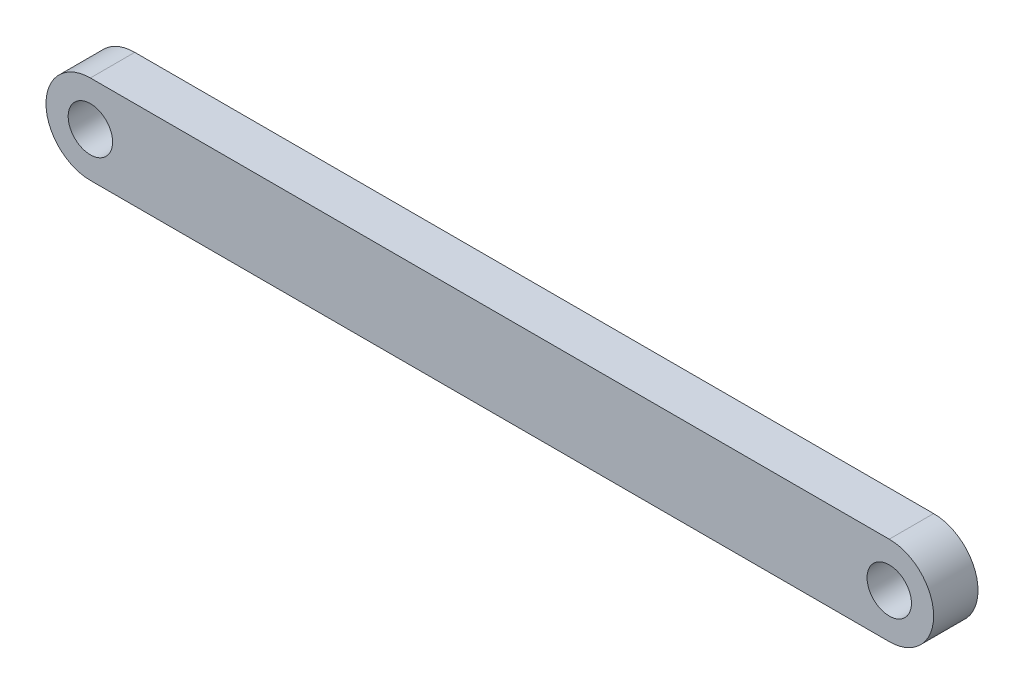
ISO-10303-21;
HEADER;
FILE_DESCRIPTION(('STEP AP214'),'2;1');
FILE_NAME('part.step','',(''),(''),'','','');
FILE_SCHEMA(('AUTOMOTIVE_DESIGN { 1 0 10303 214 1 1 1 1 }'));
ENDSEC;
DATA;
#1=APPLICATION_CONTEXT('core data for automotive mechanical design processes');
#2=APPLICATION_PROTOCOL_DEFINITION('international standard','automotive_design',2000,#1);
#3=PRODUCT_CONTEXT('',#1,'mechanical');
#4=PRODUCT('Part','Part','',(#3));
#5=PRODUCT_RELATED_PRODUCT_CATEGORY('part','',(#4));
#6=PRODUCT_DEFINITION_FORMATION('','',#4);
#7=PRODUCT_DEFINITION_CONTEXT('part definition',#1,'design');
#8=PRODUCT_DEFINITION('design','',#6,#7);
#9=PRODUCT_DEFINITION_SHAPE('','',#8);
#10=(LENGTH_UNIT() NAMED_UNIT(*) SI_UNIT(.MILLI.,.METRE.));
#11=(NAMED_UNIT(*) PLANE_ANGLE_UNIT() SI_UNIT($,.RADIAN.));
#12=(NAMED_UNIT(*) SI_UNIT($,.STERADIAN.) SOLID_ANGLE_UNIT());
#13=UNCERTAINTY_MEASURE_WITH_UNIT(LENGTH_MEASURE(1.E-05),#10,'distance_accuracy_value','');
#14=(GEOMETRIC_REPRESENTATION_CONTEXT(3) GLOBAL_UNCERTAINTY_ASSIGNED_CONTEXT((#13)) GLOBAL_UNIT_ASSIGNED_CONTEXT((#10,
#11,#12)) REPRESENTATION_CONTEXT('',''));
#15=CARTESIAN_POINT('',(0.,0.,0.));
#16=DIRECTION('',(0.,0.,1.));
#17=DIRECTION('',(1.,0.,0.));
#18=AXIS2_PLACEMENT_3D('',#15,#16,#17);
#19=CARTESIAN_POINT('',(-22.86,0.,-1.27));
#20=DIRECTION('',(0.,0.,1.));
#21=DIRECTION('',(1.,0.,0.));
#22=AXIS2_PLACEMENT_3D('',#19,#20,#21);
#23=CYLINDRICAL_SURFACE('',#22,2.54000000000001);
#24=DIRECTION('',(0.,0.,1.));
#25=VECTOR('',#24,1.);
#26=CARTESIAN_POINT('',(-22.86,-2.54000000000001,-1.27));
#27=LINE('',#26,#25);
#28=CARTESIAN_POINT('',(-22.86,-2.54000000000001,-1.27));
#29=VERTEX_POINT('',#28);
#30=CARTESIAN_POINT('',(-22.86,-2.54000000000001,1.27));
#31=VERTEX_POINT('',#30);
#32=EDGE_CURVE('E36',#29,#31,#27,.T.);
#33=ORIENTED_EDGE('',*,*,#32,.T.);
#34=CARTESIAN_POINT('',(-22.86,0.,1.27));
#35=DIRECTION('',(0.,0.,1.));
#36=DIRECTION('',(1.,0.,0.));
#37=AXIS2_PLACEMENT_3D('',#34,#35,#36);
#38=CIRCLE('',#37,2.54000000000001);
#39=CARTESIAN_POINT('',(-22.86,2.54000000000001,1.27));
#40=VERTEX_POINT('',#39);
#41=EDGE_CURVE('E73',#40,#31,#38,.T.);
#42=ORIENTED_EDGE('',*,*,#41,.F.);
#43=DIRECTION('',(0.,0.,1.));
#44=VECTOR('',#43,1.);
#45=CARTESIAN_POINT('',(-22.86,2.54000000000001,-1.27));
#46=LINE('',#45,#44);
#47=CARTESIAN_POINT('',(-22.86,2.54000000000001,-1.27));
#48=VERTEX_POINT('',#47);
#49=EDGE_CURVE('E11',#48,#40,#46,.T.);
#50=ORIENTED_EDGE('',*,*,#49,.F.);
#51=CARTESIAN_POINT('',(-22.86,0.,-1.27));
#52=DIRECTION('',(0.,0.,1.));
#53=DIRECTION('',(1.,0.,0.));
#54=AXIS2_PLACEMENT_3D('',#51,#52,#53);
#55=CIRCLE('',#54,2.54000000000001);
#56=EDGE_CURVE('E74',#48,#29,#55,.T.);
#57=ORIENTED_EDGE('',*,*,#56,.T.);
#58=EDGE_LOOP('',(#33,#42,#50,#57));
#59=FACE_BOUND('',#58,.T.);
#60=ADVANCED_FACE('F33',(#59),#23,.T.);
#61=CARTESIAN_POINT('',(-22.86,2.54000000000001,-1.27));
#62=DIRECTION('',(0.,1.,0.));
#63=DIRECTION('',(0.,0.,1.));
#64=AXIS2_PLACEMENT_3D('',#61,#62,#63);
#65=PLANE('',#64);
#66=ORIENTED_EDGE('',*,*,#49,.T.);
#67=DIRECTION('',(-1.,0.,0.));
#68=VECTOR('',#67,1.);
#69=CARTESIAN_POINT('',(-22.86,2.54000000000001,1.27));
#70=LINE('',#69,#68);
#71=CARTESIAN_POINT('',(22.86,2.54000000000001,1.27));
#72=VERTEX_POINT('',#71);
#73=EDGE_CURVE('E91',#72,#40,#70,.T.);
#74=ORIENTED_EDGE('',*,*,#73,.F.);
#75=DIRECTION('',(0.,0.,1.));
#76=VECTOR('',#75,1.);
#77=CARTESIAN_POINT('',(22.86,2.54000000000001,-1.27));
#78=LINE('',#77,#76);
#79=CARTESIAN_POINT('',(22.86,2.54000000000001,-1.27));
#80=VERTEX_POINT('',#79);
#81=EDGE_CURVE('E41',#80,#72,#78,.T.);
#82=ORIENTED_EDGE('',*,*,#81,.F.);
#83=DIRECTION('',(-1.,0.,0.));
#84=VECTOR('',#83,1.);
#85=CARTESIAN_POINT('',(-22.86,2.54000000000001,-1.27));
#86=LINE('',#85,#84);
#87=EDGE_CURVE('E79',#80,#48,#86,.T.);
#88=ORIENTED_EDGE('',*,*,#87,.T.);
#89=EDGE_LOOP('',(#66,#74,#82,#88));
#90=FACE_BOUND('',#89,.T.);
#91=ADVANCED_FACE('F117',(#90),#65,.T.);
#92=CARTESIAN_POINT('',(22.86,0.,-1.27));
#93=DIRECTION('',(0.,0.,1.));
#94=DIRECTION('',(1.,0.,0.));
#95=AXIS2_PLACEMENT_3D('',#92,#93,#94);
#96=CYLINDRICAL_SURFACE('',#95,2.54000000000001);
#97=ORIENTED_EDGE('',*,*,#81,.T.);
#98=CARTESIAN_POINT('',(22.86,0.,1.27));
#99=DIRECTION('',(0.,0.,1.));
#100=DIRECTION('',(1.,0.,0.));
#101=AXIS2_PLACEMENT_3D('',#98,#99,#100);
#102=CIRCLE('',#101,2.54000000000001);
#103=CARTESIAN_POINT('',(22.86,-2.54000000000001,1.27));
#104=VERTEX_POINT('',#103);
#105=EDGE_CURVE('E86',#104,#72,#102,.T.);
#106=ORIENTED_EDGE('',*,*,#105,.F.);
#107=DIRECTION('',(0.,0.,1.));
#108=VECTOR('',#107,1.);
#109=CARTESIAN_POINT('',(22.86,-2.54000000000001,-1.27));
#110=LINE('',#109,#108);
#111=CARTESIAN_POINT('',(22.86,-2.54000000000001,-1.27));
#112=VERTEX_POINT('',#111);
#113=EDGE_CURVE('E78',#112,#104,#110,.T.);
#114=ORIENTED_EDGE('',*,*,#113,.F.);
#115=CARTESIAN_POINT('',(22.86,0.,-1.27));
#116=DIRECTION('',(0.,0.,1.));
#117=DIRECTION('',(1.,0.,0.));
#118=AXIS2_PLACEMENT_3D('',#115,#116,#117);
#119=CIRCLE('',#118,2.54000000000001);
#120=EDGE_CURVE('E110',#112,#80,#119,.T.);
#121=ORIENTED_EDGE('',*,*,#120,.T.);
#122=EDGE_LOOP('',(#97,#106,#114,#121));
#123=FACE_BOUND('',#122,.T.);
#124=ADVANCED_FACE('F114',(#123),#96,.T.);
#125=CARTESIAN_POINT('',(-22.86,-2.54000000000001,-1.27));
#126=DIRECTION('',(0.,-1.,0.));
#127=DIRECTION('',(0.,0.,-1.));
#128=AXIS2_PLACEMENT_3D('',#125,#126,#127);
#129=PLANE('',#128);
#130=ORIENTED_EDGE('',*,*,#113,.T.);
#131=DIRECTION('',(1.,0.,0.));
#132=VECTOR('',#131,1.);
#133=CARTESIAN_POINT('',(-22.86,-2.54000000000001,1.27));
#134=LINE('',#133,#132);
#135=EDGE_CURVE('E81',#31,#104,#134,.T.);
#136=ORIENTED_EDGE('',*,*,#135,.F.);
#137=ORIENTED_EDGE('',*,*,#32,.F.);
#138=DIRECTION('',(1.,0.,0.));
#139=VECTOR('',#138,1.);
#140=CARTESIAN_POINT('',(-22.86,-2.54000000000001,-1.27));
#141=LINE('',#140,#139);
#142=EDGE_CURVE('E108',#29,#112,#141,.T.);
#143=ORIENTED_EDGE('',*,*,#142,.T.);
#144=EDGE_LOOP('',(#130,#136,#137,#143));
#145=FACE_BOUND('',#144,.T.);
#146=ADVANCED_FACE('F82',(#145),#129,.T.);
#147=CARTESIAN_POINT('',(-22.86,0.,-1.27));
#148=DIRECTION('',(0.,0.,1.));
#149=DIRECTION('',(1.,0.,0.));
#150=AXIS2_PLACEMENT_3D('',#147,#148,#149);
#151=PLANE('',#150);
#152=CARTESIAN_POINT('',(22.86,0.,-1.27));
#153=DIRECTION('',(0.,0.,1.));
#154=DIRECTION('',(1.,0.,0.));
#155=AXIS2_PLACEMENT_3D('',#152,#153,#154);
#156=CIRCLE('',#155,1.27);
#157=CARTESIAN_POINT('',(24.13,0.,-1.27));
#158=VERTEX_POINT('',#157);
#159=EDGE_CURVE('E101',#158,#158,#156,.T.);
#160=ORIENTED_EDGE('',*,*,#159,.T.);
#161=EDGE_LOOP('',(#160));
#162=FACE_BOUND('',#161,.T.);
#163=CARTESIAN_POINT('',(-22.86,0.,-1.27));
#164=DIRECTION('',(0.,0.,1.));
#165=DIRECTION('',(1.,0.,0.));
#166=AXIS2_PLACEMENT_3D('',#163,#164,#165);
#167=CIRCLE('',#166,1.27);
#168=CARTESIAN_POINT('',(-21.59,0.,-1.27));
#169=VERTEX_POINT('',#168);
#170=EDGE_CURVE('E104',#169,#169,#167,.T.);
#171=ORIENTED_EDGE('',*,*,#170,.T.);
#172=EDGE_LOOP('',(#171));
#173=FACE_BOUND('',#172,.T.);
#174=ORIENTED_EDGE('',*,*,#56,.F.);
#175=ORIENTED_EDGE('',*,*,#87,.F.);
#176=ORIENTED_EDGE('',*,*,#120,.F.);
#177=ORIENTED_EDGE('',*,*,#142,.F.);
#178=EDGE_LOOP('',(#174,#175,#176,#177));
#179=FACE_BOUND('',#178,.T.);
#180=ADVANCED_FACE('F119',(#162,#173,#179),#151,.F.);
#181=CARTESIAN_POINT('',(-22.86,0.,-1.27));
#182=DIRECTION('',(0.,0.,1.));
#183=DIRECTION('',(1.,0.,0.));
#184=AXIS2_PLACEMENT_3D('',#181,#182,#183);
#185=CYLINDRICAL_SURFACE('',#184,1.27);
#186=ORIENTED_EDGE('',*,*,#170,.F.);
#187=EDGE_LOOP('',(#186));
#188=FACE_BOUND('',#187,.T.);
#189=CARTESIAN_POINT('',(-22.86,0.,1.27));
#190=DIRECTION('',(0.,0.,1.));
#191=DIRECTION('',(1.,0.,0.));
#192=AXIS2_PLACEMENT_3D('',#189,#190,#191);
#193=CIRCLE('',#192,1.27);
#194=CARTESIAN_POINT('',(-21.59,0.,1.27));
#195=VERTEX_POINT('',#194);
#196=EDGE_CURVE('E92',#195,#195,#193,.T.);
#197=ORIENTED_EDGE('',*,*,#196,.T.);
#198=EDGE_LOOP('',(#197));
#199=FACE_BOUND('',#198,.T.);
#200=ADVANCED_FACE('F121',(#188,#199),#185,.F.);
#201=CARTESIAN_POINT('',(22.86,0.,-1.27));
#202=DIRECTION('',(0.,0.,1.));
#203=DIRECTION('',(1.,0.,0.));
#204=AXIS2_PLACEMENT_3D('',#201,#202,#203);
#205=CYLINDRICAL_SURFACE('',#204,1.27);
#206=ORIENTED_EDGE('',*,*,#159,.F.);
#207=EDGE_LOOP('',(#206));
#208=FACE_BOUND('',#207,.T.);
#209=CARTESIAN_POINT('',(22.86,0.,1.27));
#210=DIRECTION('',(0.,0.,1.));
#211=DIRECTION('',(1.,0.,0.));
#212=AXIS2_PLACEMENT_3D('',#209,#210,#211);
#213=CIRCLE('',#212,1.27);
#214=CARTESIAN_POINT('',(24.13,0.,1.27));
#215=VERTEX_POINT('',#214);
#216=EDGE_CURVE('E95',#215,#215,#213,.T.);
#217=ORIENTED_EDGE('',*,*,#216,.T.);
#218=EDGE_LOOP('',(#217));
#219=FACE_BOUND('',#218,.T.);
#220=ADVANCED_FACE('F128',(#208,#219),#205,.F.);
#221=CARTESIAN_POINT('',(-22.86,0.,1.27));
#222=DIRECTION('',(0.,0.,1.));
#223=DIRECTION('',(1.,0.,0.));
#224=AXIS2_PLACEMENT_3D('',#221,#222,#223);
#225=PLANE('',#224);
#226=ORIENTED_EDGE('',*,*,#196,.F.);
#227=EDGE_LOOP('',(#226));
#228=FACE_BOUND('',#227,.T.);
#229=ORIENTED_EDGE('',*,*,#41,.T.);
#230=ORIENTED_EDGE('',*,*,#135,.T.);
#231=ORIENTED_EDGE('',*,*,#105,.T.);
#232=ORIENTED_EDGE('',*,*,#73,.T.);
#233=EDGE_LOOP('',(#229,#230,#231,#232));
#234=FACE_BOUND('',#233,.T.);
#235=ORIENTED_EDGE('',*,*,#216,.F.);
#236=EDGE_LOOP('',(#235));
#237=FACE_BOUND('',#236,.T.);
#238=ADVANCED_FACE('F89',(#228,#234,#237),#225,.T.);
#239=CLOSED_SHELL('',(#60,#91,#124,#146,#180,#200,#220,#238));
#240=MANIFOLD_SOLID_BREP('B2',#239);
#241=ADVANCED_BREP_SHAPE_REPRESENTATION('',(#18,#240),#14);
#242=SHAPE_DEFINITION_REPRESENTATION(#9,#241);
ENDSEC;
END-ISO-10303-21;
